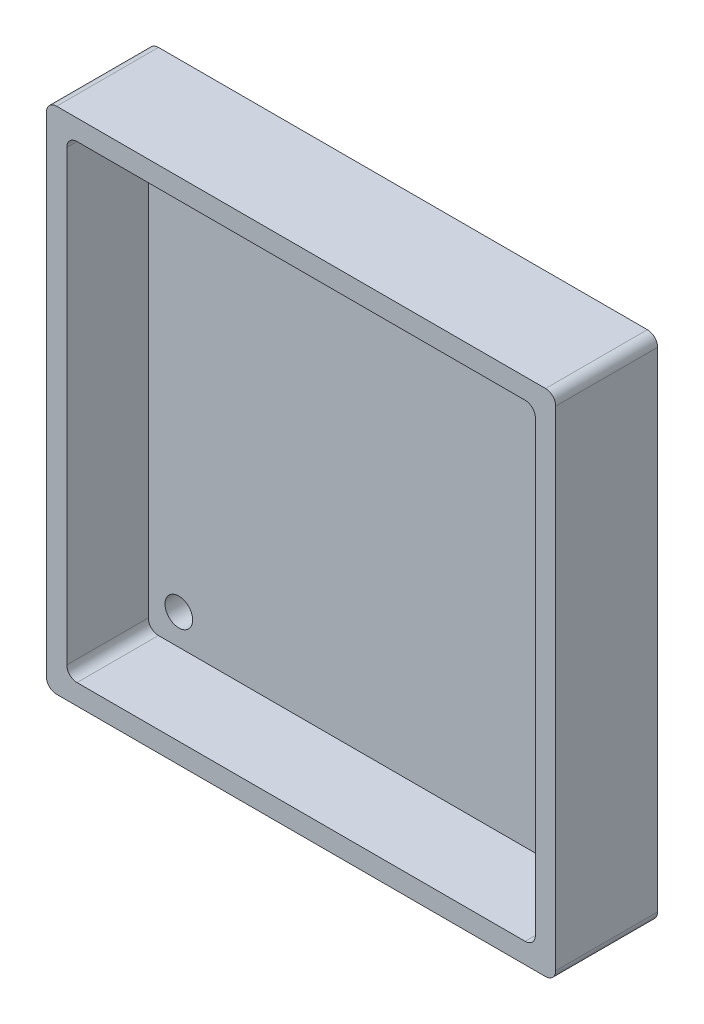
ISO-10303-21;
HEADER;
FILE_DESCRIPTION(('STEP AP214'),'2;1');
FILE_NAME('part.step','',(''),(''),'','','');
FILE_SCHEMA(('AUTOMOTIVE_DESIGN { 1 0 10303 214 1 1 1 1 }'));
ENDSEC;
DATA;
#1=APPLICATION_CONTEXT('core data for automotive mechanical design processes');
#2=APPLICATION_PROTOCOL_DEFINITION('international standard','automotive_design',2000,#1);
#3=PRODUCT_CONTEXT('',#1,'mechanical');
#4=PRODUCT('Part','Part','',(#3));
#5=PRODUCT_RELATED_PRODUCT_CATEGORY('part','',(#4));
#6=PRODUCT_DEFINITION_FORMATION('','',#4);
#7=PRODUCT_DEFINITION_CONTEXT('part definition',#1,'design');
#8=PRODUCT_DEFINITION('design','',#6,#7);
#9=PRODUCT_DEFINITION_SHAPE('','',#8);
#10=(LENGTH_UNIT() NAMED_UNIT(*) SI_UNIT(.MILLI.,.METRE.));
#11=(NAMED_UNIT(*) PLANE_ANGLE_UNIT() SI_UNIT($,.RADIAN.));
#12=(NAMED_UNIT(*) SI_UNIT($,.STERADIAN.) SOLID_ANGLE_UNIT());
#13=UNCERTAINTY_MEASURE_WITH_UNIT(LENGTH_MEASURE(1.E-05),#10,'distance_accuracy_value','');
#14=(GEOMETRIC_REPRESENTATION_CONTEXT(3) GLOBAL_UNCERTAINTY_ASSIGNED_CONTEXT((#13)) GLOBAL_UNIT_ASSIGNED_CONTEXT((#10,
#11,#12)) REPRESENTATION_CONTEXT('',''));
#15=CARTESIAN_POINT('',(0.,0.,0.));
#16=DIRECTION('',(0.,0.,1.));
#17=DIRECTION('',(1.,0.,0.));
#18=AXIS2_PLACEMENT_3D('',#15,#16,#17);
#19=CARTESIAN_POINT('',(-50.,50.,20.));
#20=DIRECTION('',(1.,0.,0.));
#21=DIRECTION('',(0.,1.,0.));
#22=AXIS2_PLACEMENT_3D('',#19,#20,#21);
#23=PLANE('',#22);
#24=DIRECTION('',(0.,-1.,0.));
#25=VECTOR('',#24,1.);
#26=CARTESIAN_POINT('',(-50.,50.,0.));
#27=LINE('',#26,#25);
#28=CARTESIAN_POINT('',(-50.,48.,0.));
#29=VERTEX_POINT('',#28);
#30=CARTESIAN_POINT('',(-50.,-48.,0.));
#31=VERTEX_POINT('',#30);
#32=EDGE_CURVE('E204',#29,#31,#27,.T.);
#33=ORIENTED_EDGE('',*,*,#32,.T.);
#34=DIRECTION('',(0.,0.,-1.));
#35=VECTOR('',#34,1.);
#36=CARTESIAN_POINT('',(-50.,-48.,20.));
#37=LINE('',#36,#35);
#38=CARTESIAN_POINT('',(-50.,-48.,20.));
#39=VERTEX_POINT('',#38);
#40=EDGE_CURVE('E264',#31,#39,#37,.F.);
#41=ORIENTED_EDGE('',*,*,#40,.T.);
#42=DIRECTION('',(0.,-1.,0.));
#43=VECTOR('',#42,1.);
#44=CARTESIAN_POINT('',(-50.,50.,20.));
#45=LINE('',#44,#43);
#46=CARTESIAN_POINT('',(-50.,48.,20.));
#47=VERTEX_POINT('',#46);
#48=EDGE_CURVE('E193',#47,#39,#45,.T.);
#49=ORIENTED_EDGE('',*,*,#48,.F.);
#50=DIRECTION('',(0.,0.,-1.));
#51=VECTOR('',#50,1.);
#52=CARTESIAN_POINT('',(-50.,48.,20.));
#53=LINE('',#52,#51);
#54=EDGE_CURVE('E261',#47,#29,#53,.T.);
#55=ORIENTED_EDGE('',*,*,#54,.T.);
#56=EDGE_LOOP('',(#33,#41,#49,#55));
#57=FACE_BOUND('',#56,.T.);
#58=ADVANCED_FACE('F37',(#57),#23,.F.);
#59=CARTESIAN_POINT('',(50.,-50.,20.));
#60=DIRECTION('',(0.,1.,0.));
#61=DIRECTION('',(-1.,0.,0.));
#62=AXIS2_PLACEMENT_3D('',#59,#60,#61);
#63=PLANE('',#62);
#64=DIRECTION('',(1.,0.,0.));
#65=VECTOR('',#64,1.);
#66=CARTESIAN_POINT('',(50.,-50.,0.));
#67=LINE('',#66,#65);
#68=CARTESIAN_POINT('',(-48.,-50.,0.));
#69=VERTEX_POINT('',#68);
#70=CARTESIAN_POINT('',(48.,-50.,0.));
#71=VERTEX_POINT('',#70);
#72=EDGE_CURVE('E207',#69,#71,#67,.T.);
#73=ORIENTED_EDGE('',*,*,#72,.T.);
#74=DIRECTION('',(0.,0.,-1.));
#75=VECTOR('',#74,1.);
#76=CARTESIAN_POINT('',(48.,-50.,20.));
#77=LINE('',#76,#75);
#78=CARTESIAN_POINT('',(48.,-50.,20.));
#79=VERTEX_POINT('',#78);
#80=EDGE_CURVE('E252',#71,#79,#77,.F.);
#81=ORIENTED_EDGE('',*,*,#80,.T.);
#82=DIRECTION('',(1.,0.,0.));
#83=VECTOR('',#82,1.);
#84=CARTESIAN_POINT('',(50.,-50.,20.));
#85=LINE('',#84,#83);
#86=CARTESIAN_POINT('',(-48.,-50.,20.));
#87=VERTEX_POINT('',#86);
#88=EDGE_CURVE('E196',#87,#79,#85,.T.);
#89=ORIENTED_EDGE('',*,*,#88,.F.);
#90=DIRECTION('',(0.,0.,-1.));
#91=VECTOR('',#90,1.);
#92=CARTESIAN_POINT('',(-48.,-50.,20.));
#93=LINE('',#92,#91);
#94=EDGE_CURVE('E249',#87,#69,#93,.T.);
#95=ORIENTED_EDGE('',*,*,#94,.T.);
#96=EDGE_LOOP('',(#73,#81,#89,#95));
#97=FACE_BOUND('',#96,.T.);
#98=ADVANCED_FACE('F347',(#97),#63,.F.);
#99=CARTESIAN_POINT('',(50.,50.,20.));
#100=DIRECTION('',(-1.,0.,0.));
#101=DIRECTION('',(0.,-1.,0.));
#102=AXIS2_PLACEMENT_3D('',#99,#100,#101);
#103=PLANE('',#102);
#104=DIRECTION('',(0.,1.,0.));
#105=VECTOR('',#104,1.);
#106=CARTESIAN_POINT('',(50.,50.,20.));
#107=LINE('',#106,#105);
#108=CARTESIAN_POINT('',(50.,-48.,20.));
#109=VERTEX_POINT('',#108);
#110=CARTESIAN_POINT('',(50.,48.,20.));
#111=VERTEX_POINT('',#110);
#112=EDGE_CURVE('E200',#109,#111,#107,.T.);
#113=ORIENTED_EDGE('',*,*,#112,.F.);
#114=DIRECTION('',(0.,0.,-1.));
#115=VECTOR('',#114,1.);
#116=CARTESIAN_POINT('',(50.,-48.,20.));
#117=LINE('',#116,#115);
#118=CARTESIAN_POINT('',(50.,-48.,0.));
#119=VERTEX_POINT('',#118);
#120=EDGE_CURVE('E238',#109,#119,#117,.T.);
#121=ORIENTED_EDGE('',*,*,#120,.T.);
#122=DIRECTION('',(0.,1.,0.));
#123=VECTOR('',#122,1.);
#124=CARTESIAN_POINT('',(50.,50.,0.));
#125=LINE('',#124,#123);
#126=CARTESIAN_POINT('',(50.,48.,0.));
#127=VERTEX_POINT('',#126);
#128=EDGE_CURVE('E210',#119,#127,#125,.T.);
#129=ORIENTED_EDGE('',*,*,#128,.T.);
#130=DIRECTION('',(0.,0.,-1.));
#131=VECTOR('',#130,1.);
#132=CARTESIAN_POINT('',(50.,48.,20.));
#133=LINE('',#132,#131);
#134=EDGE_CURVE('E236',#127,#111,#133,.F.);
#135=ORIENTED_EDGE('',*,*,#134,.T.);
#136=EDGE_LOOP('',(#113,#121,#129,#135));
#137=FACE_BOUND('',#136,.T.);
#138=ADVANCED_FACE('F353',(#137),#103,.F.);
#139=CARTESIAN_POINT('',(50.,50.,20.));
#140=DIRECTION('',(0.,-1.,0.));
#141=DIRECTION('',(1.,0.,0.));
#142=AXIS2_PLACEMENT_3D('',#139,#140,#141);
#143=PLANE('',#142);
#144=DIRECTION('',(-1.,0.,0.));
#145=VECTOR('',#144,1.);
#146=CARTESIAN_POINT('',(50.,50.,0.));
#147=LINE('',#146,#145);
#148=CARTESIAN_POINT('',(48.,50.,0.));
#149=VERTEX_POINT('',#148);
#150=CARTESIAN_POINT('',(-48.,50.,0.));
#151=VERTEX_POINT('',#150);
#152=EDGE_CURVE('E197',#149,#151,#147,.T.);
#153=ORIENTED_EDGE('',*,*,#152,.T.);
#154=DIRECTION('',(0.,0.,-1.));
#155=VECTOR('',#154,1.);
#156=CARTESIAN_POINT('',(-48.,50.,20.));
#157=LINE('',#156,#155);
#158=CARTESIAN_POINT('',(-48.,50.,20.));
#159=VERTEX_POINT('',#158);
#160=EDGE_CURVE('E54',#151,#159,#157,.F.);
#161=ORIENTED_EDGE('',*,*,#160,.T.);
#162=DIRECTION('',(-1.,0.,0.));
#163=VECTOR('',#162,1.);
#164=CARTESIAN_POINT('',(50.,50.,20.));
#165=LINE('',#164,#163);
#166=CARTESIAN_POINT('',(48.,50.,20.));
#167=VERTEX_POINT('',#166);
#168=EDGE_CURVE('E202',#167,#159,#165,.T.);
#169=ORIENTED_EDGE('',*,*,#168,.F.);
#170=DIRECTION('',(0.,0.,-1.));
#171=VECTOR('',#170,1.);
#172=CARTESIAN_POINT('',(48.,50.,20.));
#173=LINE('',#172,#171);
#174=EDGE_CURVE('E266',#167,#149,#173,.T.);
#175=ORIENTED_EDGE('',*,*,#174,.T.);
#176=EDGE_LOOP('',(#153,#161,#169,#175));
#177=FACE_BOUND('',#176,.T.);
#178=ADVANCED_FACE('F532',(#177),#143,.F.);
#179=CARTESIAN_POINT('',(0.,0.,20.));
#180=DIRECTION('',(0.,0.,-1.));
#181=DIRECTION('',(-1.,0.,0.));
#182=AXIS2_PLACEMENT_3D('',#179,#180,#181);
#183=PLANE('',#182);
#184=DIRECTION('',(1.,0.,0.));
#185=VECTOR('',#184,1.);
#186=CARTESIAN_POINT('',(46.,-46.,20.));
#187=LINE('',#186,#185);
#188=CARTESIAN_POINT('',(-44.,-46.,20.));
#189=VERTEX_POINT('',#188);
#190=CARTESIAN_POINT('',(44.,-46.,20.));
#191=VERTEX_POINT('',#190);
#192=EDGE_CURVE('E178',#189,#191,#187,.T.);
#193=ORIENTED_EDGE('',*,*,#192,.F.);
#194=CARTESIAN_POINT('',(-44.,-44.,20.));
#195=DIRECTION('',(0.,0.,-1.));
#196=DIRECTION('',(-1.,0.,0.));
#197=AXIS2_PLACEMENT_3D('',#194,#195,#196);
#198=CIRCLE('',#197,2.);
#199=CARTESIAN_POINT('',(-46.,-44.,20.));
#200=VERTEX_POINT('',#199);
#201=EDGE_CURVE('E11',#189,#200,#198,.T.);
#202=ORIENTED_EDGE('',*,*,#201,.T.);
#203=DIRECTION('',(0.,-1.,0.));
#204=VECTOR('',#203,1.);
#205=CARTESIAN_POINT('',(-46.,-46.,20.));
#206=LINE('',#205,#204);
#207=CARTESIAN_POINT('',(-46.,44.,20.));
#208=VERTEX_POINT('',#207);
#209=EDGE_CURVE('E169',#208,#200,#206,.T.);
#210=ORIENTED_EDGE('',*,*,#209,.F.);
#211=CARTESIAN_POINT('',(-44.,44.,20.));
#212=DIRECTION('',(0.,0.,-1.));
#213=DIRECTION('',(-1.,0.,0.));
#214=AXIS2_PLACEMENT_3D('',#211,#212,#213);
#215=CIRCLE('',#214,2.);
#216=CARTESIAN_POINT('',(-44.,46.,20.));
#217=VERTEX_POINT('',#216);
#218=EDGE_CURVE('E153',#208,#217,#215,.T.);
#219=ORIENTED_EDGE('',*,*,#218,.T.);
#220=DIRECTION('',(-1.,0.,0.));
#221=VECTOR('',#220,1.);
#222=CARTESIAN_POINT('',(46.,46.,20.));
#223=LINE('',#222,#221);
#224=CARTESIAN_POINT('',(44.,46.,20.));
#225=VERTEX_POINT('',#224);
#226=EDGE_CURVE('E191',#225,#217,#223,.T.);
#227=ORIENTED_EDGE('',*,*,#226,.F.);
#228=CARTESIAN_POINT('',(44.,44.,20.));
#229=DIRECTION('',(0.,0.,-1.));
#230=DIRECTION('',(-1.,0.,0.));
#231=AXIS2_PLACEMENT_3D('',#228,#229,#230);
#232=CIRCLE('',#231,2.);
#233=CARTESIAN_POINT('',(46.,44.,20.));
#234=VERTEX_POINT('',#233);
#235=EDGE_CURVE('E163',#225,#234,#232,.T.);
#236=ORIENTED_EDGE('',*,*,#235,.T.);
#237=DIRECTION('',(0.,1.,0.));
#238=VECTOR('',#237,1.);
#239=CARTESIAN_POINT('',(46.,-46.,20.));
#240=LINE('',#239,#238);
#241=CARTESIAN_POINT('',(46.,-44.,20.));
#242=VERTEX_POINT('',#241);
#243=EDGE_CURVE('E181',#242,#234,#240,.T.);
#244=ORIENTED_EDGE('',*,*,#243,.F.);
#245=CARTESIAN_POINT('',(44.,-44.,20.));
#246=DIRECTION('',(0.,0.,-1.));
#247=DIRECTION('',(-1.,0.,0.));
#248=AXIS2_PLACEMENT_3D('',#245,#246,#247);
#249=CIRCLE('',#248,2.);
#250=EDGE_CURVE('E46',#242,#191,#249,.T.);
#251=ORIENTED_EDGE('',*,*,#250,.T.);
#252=EDGE_LOOP('',(#193,#202,#210,#219,#227,#236,#244,#251));
#253=FACE_BOUND('',#252,.T.);
#254=ORIENTED_EDGE('',*,*,#88,.T.);
#255=CARTESIAN_POINT('',(48.,-48.,20.));
#256=DIRECTION('',(0.,0.,-1.));
#257=DIRECTION('',(-1.,0.,0.));
#258=AXIS2_PLACEMENT_3D('',#255,#256,#257);
#259=CIRCLE('',#258,2.);
#260=EDGE_CURVE('E259',#79,#109,#259,.F.);
#261=ORIENTED_EDGE('',*,*,#260,.T.);
#262=ORIENTED_EDGE('',*,*,#112,.T.);
#263=CARTESIAN_POINT('',(48.,48.,20.));
#264=DIRECTION('',(0.,0.,-1.));
#265=DIRECTION('',(-1.,0.,0.));
#266=AXIS2_PLACEMENT_3D('',#263,#264,#265);
#267=CIRCLE('',#266,2.);
#268=EDGE_CURVE('E61',#111,#167,#267,.F.);
#269=ORIENTED_EDGE('',*,*,#268,.T.);
#270=ORIENTED_EDGE('',*,*,#168,.T.);
#271=CARTESIAN_POINT('',(-48.,48.,20.));
#272=DIRECTION('',(0.,0.,-1.));
#273=DIRECTION('',(-1.,0.,0.));
#274=AXIS2_PLACEMENT_3D('',#271,#272,#273);
#275=CIRCLE('',#274,2.);
#276=EDGE_CURVE('E255',#159,#47,#275,.F.);
#277=ORIENTED_EDGE('',*,*,#276,.T.);
#278=ORIENTED_EDGE('',*,*,#48,.T.);
#279=CARTESIAN_POINT('',(-48.,-48.,20.));
#280=DIRECTION('',(0.,0.,-1.));
#281=DIRECTION('',(-1.,0.,0.));
#282=AXIS2_PLACEMENT_3D('',#279,#280,#281);
#283=CIRCLE('',#282,2.);
#284=EDGE_CURVE('E257',#39,#87,#283,.F.);
#285=ORIENTED_EDGE('',*,*,#284,.T.);
#286=EDGE_LOOP('',(#254,#261,#262,#269,#270,#277,#278,#285));
#287=FACE_BOUND('',#286,.T.);
#288=ADVANCED_FACE('F177',(#253,#287),#183,.F.);
#289=CARTESIAN_POINT('',(0.,0.,0.));
#290=DIRECTION('',(0.,0.,-1.));
#291=DIRECTION('',(-1.,0.,0.));
#292=AXIS2_PLACEMENT_3D('',#289,#290,#291);
#293=PLANE('',#292);
#294=CARTESIAN_POINT('',(-39.9999999999977,-40.,0.));
#295=DIRECTION('',(0.,0.,1.));
#296=DIRECTION('',(1.,0.,0.));
#297=AXIS2_PLACEMENT_3D('',#294,#295,#296);
#298=CIRCLE('',#297,2.71396680124798);
#299=CARTESIAN_POINT('',(-37.2860331987498,-40.,0.));
#300=VERTEX_POINT('',#299);
#301=EDGE_CURVE('E295',#300,#300,#298,.T.);
#302=ORIENTED_EDGE('',*,*,#301,.T.);
#303=EDGE_LOOP('',(#302));
#304=FACE_BOUND('',#303,.T.);
#305=CARTESIAN_POINT('',(40.0000000000023,-39.9999999999978,0.));
#306=DIRECTION('',(0.,0.,1.));
#307=DIRECTION('',(1.,0.,0.));
#308=AXIS2_PLACEMENT_3D('',#305,#306,#307);
#309=CIRCLE('',#308,2.71396680124995);
#310=CARTESIAN_POINT('',(42.7139668012522,-39.9999999999978,0.));
#311=VERTEX_POINT('',#310);
#312=EDGE_CURVE('E292',#311,#311,#309,.T.);
#313=ORIENTED_EDGE('',*,*,#312,.T.);
#314=EDGE_LOOP('',(#313));
#315=FACE_BOUND('',#314,.T.);
#316=CARTESIAN_POINT('',(40.,40.0000000000023,0.));
#317=DIRECTION('',(0.,0.,1.));
#318=DIRECTION('',(1.,0.,0.));
#319=AXIS2_PLACEMENT_3D('',#316,#317,#318);
#320=CIRCLE('',#319,2.71396680124912);
#321=CARTESIAN_POINT('',(42.7139668012491,40.0000000000023,0.));
#322=VERTEX_POINT('',#321);
#323=EDGE_CURVE('E294',#322,#322,#320,.T.);
#324=ORIENTED_EDGE('',*,*,#323,.T.);
#325=EDGE_LOOP('',(#324));
#326=FACE_BOUND('',#325,.T.);
#327=CARTESIAN_POINT('',(-40.,40.,0.));
#328=DIRECTION('',(0.,0.,1.));
#329=DIRECTION('',(1.,0.,0.));
#330=AXIS2_PLACEMENT_3D('',#327,#328,#329);
#331=CIRCLE('',#330,2.71396680124678);
#332=CARTESIAN_POINT('',(-37.2860331987532,40.,0.));
#333=VERTEX_POINT('',#332);
#334=EDGE_CURVE('E276',#333,#333,#331,.T.);
#335=ORIENTED_EDGE('',*,*,#334,.T.);
#336=EDGE_LOOP('',(#335));
#337=FACE_BOUND('',#336,.T.);
#338=ORIENTED_EDGE('',*,*,#128,.F.);
#339=CARTESIAN_POINT('',(48.,-48.,0.));
#340=DIRECTION('',(0.,0.,-1.));
#341=DIRECTION('',(-1.,0.,0.));
#342=AXIS2_PLACEMENT_3D('',#339,#340,#341);
#343=CIRCLE('',#342,2.);
#344=EDGE_CURVE('E247',#119,#71,#343,.T.);
#345=ORIENTED_EDGE('',*,*,#344,.T.);
#346=ORIENTED_EDGE('',*,*,#72,.F.);
#347=CARTESIAN_POINT('',(-48.,-48.,0.));
#348=DIRECTION('',(0.,0.,-1.));
#349=DIRECTION('',(-1.,0.,0.));
#350=AXIS2_PLACEMENT_3D('',#347,#348,#349);
#351=CIRCLE('',#350,2.);
#352=EDGE_CURVE('E245',#69,#31,#351,.T.);
#353=ORIENTED_EDGE('',*,*,#352,.T.);
#354=ORIENTED_EDGE('',*,*,#32,.F.);
#355=CARTESIAN_POINT('',(-48.,48.,0.));
#356=DIRECTION('',(0.,0.,-1.));
#357=DIRECTION('',(-1.,0.,0.));
#358=AXIS2_PLACEMENT_3D('',#355,#356,#357);
#359=CIRCLE('',#358,2.);
#360=EDGE_CURVE('E243',#29,#151,#359,.T.);
#361=ORIENTED_EDGE('',*,*,#360,.T.);
#362=ORIENTED_EDGE('',*,*,#152,.F.);
#363=CARTESIAN_POINT('',(48.,48.,0.));
#364=DIRECTION('',(0.,0.,-1.));
#365=DIRECTION('',(-1.,0.,0.));
#366=AXIS2_PLACEMENT_3D('',#363,#364,#365);
#367=CIRCLE('',#366,2.);
#368=EDGE_CURVE('E241',#149,#127,#367,.T.);
#369=ORIENTED_EDGE('',*,*,#368,.T.);
#370=EDGE_LOOP('',(#338,#345,#346,#353,#354,#361,#362,#369));
#371=FACE_BOUND('',#370,.T.);
#372=ADVANCED_FACE('F420',(#304,#315,#326,#337,#371),#293,.T.);
#373=CARTESIAN_POINT('',(-46.,-46.,4.));
#374=DIRECTION('',(-1.,0.,0.));
#375=DIRECTION('',(0.,0.,1.));
#376=AXIS2_PLACEMENT_3D('',#373,#374,#375);
#377=PLANE('',#376);
#378=DIRECTION('',(0.,-1.,0.));
#379=VECTOR('',#378,1.);
#380=CARTESIAN_POINT('',(-46.,-46.,4.));
#381=LINE('',#380,#379);
#382=CARTESIAN_POINT('',(-46.,44.,4.));
#383=VERTEX_POINT('',#382);
#384=CARTESIAN_POINT('',(-46.,-44.,4.));
#385=VERTEX_POINT('',#384);
#386=EDGE_CURVE('E172',#383,#385,#381,.T.);
#387=ORIENTED_EDGE('',*,*,#386,.F.);
#388=DIRECTION('',(0.,0.,1.));
#389=VECTOR('',#388,1.);
#390=CARTESIAN_POINT('',(-46.,44.,20.));
#391=LINE('',#390,#389);
#392=EDGE_CURVE('E157',#383,#208,#391,.T.);
#393=ORIENTED_EDGE('',*,*,#392,.T.);
#394=ORIENTED_EDGE('',*,*,#209,.T.);
#395=DIRECTION('',(0.,0.,1.));
#396=VECTOR('',#395,1.);
#397=CARTESIAN_POINT('',(-46.,-44.,4.));
#398=LINE('',#397,#396);
#399=EDGE_CURVE('E174',#200,#385,#398,.F.);
#400=ORIENTED_EDGE('',*,*,#399,.T.);
#401=EDGE_LOOP('',(#387,#393,#394,#400));
#402=FACE_BOUND('',#401,.T.);
#403=ADVANCED_FACE('F168',(#402),#377,.F.);
#404=CARTESIAN_POINT('',(46.,46.,4.));
#405=DIRECTION('',(0.,1.,0.));
#406=DIRECTION('',(-1.,0.,0.));
#407=AXIS2_PLACEMENT_3D('',#404,#405,#406);
#408=PLANE('',#407);
#409=ORIENTED_EDGE('',*,*,#226,.T.);
#410=DIRECTION('',(0.,0.,1.));
#411=VECTOR('',#410,1.);
#412=CARTESIAN_POINT('',(-44.,46.,4.));
#413=LINE('',#412,#411);
#414=CARTESIAN_POINT('',(-44.,46.,4.));
#415=VERTEX_POINT('',#414);
#416=EDGE_CURVE('E158',#217,#415,#413,.F.);
#417=ORIENTED_EDGE('',*,*,#416,.T.);
#418=DIRECTION('',(-1.,0.,0.));
#419=VECTOR('',#418,1.);
#420=CARTESIAN_POINT('',(46.,46.,4.));
#421=LINE('',#420,#419);
#422=CARTESIAN_POINT('',(44.,46.,4.));
#423=VERTEX_POINT('',#422);
#424=EDGE_CURVE('E186',#423,#415,#421,.T.);
#425=ORIENTED_EDGE('',*,*,#424,.F.);
#426=DIRECTION('',(0.,0.,1.));
#427=VECTOR('',#426,1.);
#428=CARTESIAN_POINT('',(44.,46.,20.));
#429=LINE('',#428,#427);
#430=EDGE_CURVE('E173',#423,#225,#429,.T.);
#431=ORIENTED_EDGE('',*,*,#430,.T.);
#432=EDGE_LOOP('',(#409,#417,#425,#431));
#433=FACE_BOUND('',#432,.T.);
#434=ADVANCED_FACE('F316',(#433),#408,.F.);
#435=CARTESIAN_POINT('',(46.,-46.,4.));
#436=DIRECTION('',(1.,0.,0.));
#437=DIRECTION('',(0.,0.,-1.));
#438=AXIS2_PLACEMENT_3D('',#435,#436,#437);
#439=PLANE('',#438);
#440=ORIENTED_EDGE('',*,*,#243,.T.);
#441=DIRECTION('',(0.,0.,1.));
#442=VECTOR('',#441,1.);
#443=CARTESIAN_POINT('',(46.,44.,4.));
#444=LINE('',#443,#442);
#445=CARTESIAN_POINT('',(46.,44.,4.));
#446=VERTEX_POINT('',#445);
#447=EDGE_CURVE('E229',#234,#446,#444,.F.);
#448=ORIENTED_EDGE('',*,*,#447,.T.);
#449=DIRECTION('',(0.,1.,0.));
#450=VECTOR('',#449,1.);
#451=CARTESIAN_POINT('',(46.,-46.,4.));
#452=LINE('',#451,#450);
#453=CARTESIAN_POINT('',(46.,-44.,4.));
#454=VERTEX_POINT('',#453);
#455=EDGE_CURVE('E307',#454,#446,#452,.T.);
#456=ORIENTED_EDGE('',*,*,#455,.F.);
#457=DIRECTION('',(0.,0.,1.));
#458=VECTOR('',#457,1.);
#459=CARTESIAN_POINT('',(46.,-44.,20.));
#460=LINE('',#459,#458);
#461=EDGE_CURVE('E226',#454,#242,#460,.T.);
#462=ORIENTED_EDGE('',*,*,#461,.T.);
#463=EDGE_LOOP('',(#440,#448,#456,#462));
#464=FACE_BOUND('',#463,.T.);
#465=ADVANCED_FACE('F322',(#464),#439,.F.);
#466=CARTESIAN_POINT('',(46.,-46.,4.));
#467=DIRECTION('',(0.,-1.,0.));
#468=DIRECTION('',(1.,0.,0.));
#469=AXIS2_PLACEMENT_3D('',#466,#467,#468);
#470=PLANE('',#469);
#471=ORIENTED_EDGE('',*,*,#192,.T.);
#472=DIRECTION('',(0.,0.,1.));
#473=VECTOR('',#472,1.);
#474=CARTESIAN_POINT('',(44.,-46.,4.));
#475=LINE('',#474,#473);
#476=CARTESIAN_POINT('',(44.,-46.,4.));
#477=VERTEX_POINT('',#476);
#478=EDGE_CURVE('E234',#191,#477,#475,.F.);
#479=ORIENTED_EDGE('',*,*,#478,.T.);
#480=DIRECTION('',(1.,0.,0.));
#481=VECTOR('',#480,1.);
#482=CARTESIAN_POINT('',(46.,-46.,4.));
#483=LINE('',#482,#481);
#484=CARTESIAN_POINT('',(-44.,-46.,4.));
#485=VERTEX_POINT('',#484);
#486=EDGE_CURVE('E305',#485,#477,#483,.T.);
#487=ORIENTED_EDGE('',*,*,#486,.F.);
#488=DIRECTION('',(0.,0.,1.));
#489=VECTOR('',#488,1.);
#490=CARTESIAN_POINT('',(-44.,-46.,20.));
#491=LINE('',#490,#489);
#492=EDGE_CURVE('E231',#485,#189,#491,.T.);
#493=ORIENTED_EDGE('',*,*,#492,.T.);
#494=EDGE_LOOP('',(#471,#479,#487,#493));
#495=FACE_BOUND('',#494,.T.);
#496=ADVANCED_FACE('F329',(#495),#470,.F.);
#497=CARTESIAN_POINT('',(0.,0.,4.));
#498=DIRECTION('',(0.,0.,1.));
#499=DIRECTION('',(1.,0.,0.));
#500=AXIS2_PLACEMENT_3D('',#497,#498,#499);
#501=PLANE('',#500);
#502=CARTESIAN_POINT('',(-39.9999999999977,-40.,4.));
#503=DIRECTION('',(0.,0.,1.));
#504=DIRECTION('',(1.,0.,0.));
#505=AXIS2_PLACEMENT_3D('',#502,#503,#504);
#506=CIRCLE('',#505,2.71396680124798);
#507=CARTESIAN_POINT('',(-37.2860331987498,-40.,4.));
#508=VERTEX_POINT('',#507);
#509=EDGE_CURVE('E41',#508,#508,#506,.F.);
#510=ORIENTED_EDGE('',*,*,#509,.T.);
#511=EDGE_LOOP('',(#510));
#512=FACE_BOUND('',#511,.T.);
#513=CARTESIAN_POINT('',(40.0000000000023,-39.9999999999978,4.));
#514=DIRECTION('',(0.,0.,1.));
#515=DIRECTION('',(1.,0.,0.));
#516=AXIS2_PLACEMENT_3D('',#513,#514,#515);
#517=CIRCLE('',#516,2.71396680124995);
#518=CARTESIAN_POINT('',(42.7139668012522,-39.9999999999978,4.));
#519=VERTEX_POINT('',#518);
#520=EDGE_CURVE('E184',#519,#519,#517,.F.);
#521=ORIENTED_EDGE('',*,*,#520,.T.);
#522=EDGE_LOOP('',(#521));
#523=FACE_BOUND('',#522,.T.);
#524=CARTESIAN_POINT('',(40.,40.0000000000023,4.));
#525=DIRECTION('',(0.,0.,1.));
#526=DIRECTION('',(1.,0.,0.));
#527=AXIS2_PLACEMENT_3D('',#524,#525,#526);
#528=CIRCLE('',#527,2.71396680124912);
#529=CARTESIAN_POINT('',(42.7139668012491,40.0000000000023,4.));
#530=VERTEX_POINT('',#529);
#531=EDGE_CURVE('E275',#530,#530,#528,.F.);
#532=ORIENTED_EDGE('',*,*,#531,.T.);
#533=EDGE_LOOP('',(#532));
#534=FACE_BOUND('',#533,.T.);
#535=CARTESIAN_POINT('',(-40.,40.,4.));
#536=DIRECTION('',(0.,0.,1.));
#537=DIRECTION('',(1.,0.,0.));
#538=AXIS2_PLACEMENT_3D('',#535,#536,#537);
#539=CIRCLE('',#538,2.71396680124678);
#540=CARTESIAN_POINT('',(-37.2860331987532,40.,4.));
#541=VERTEX_POINT('',#540);
#542=EDGE_CURVE('E272',#541,#541,#539,.F.);
#543=ORIENTED_EDGE('',*,*,#542,.T.);
#544=EDGE_LOOP('',(#543));
#545=FACE_BOUND('',#544,.T.);
#546=ORIENTED_EDGE('',*,*,#424,.T.);
#547=CARTESIAN_POINT('',(-44.,44.,4.));
#548=DIRECTION('',(0.,0.,1.));
#549=DIRECTION('',(1.,0.,0.));
#550=AXIS2_PLACEMENT_3D('',#547,#548,#549);
#551=CIRCLE('',#550,2.);
#552=EDGE_CURVE('E224',#415,#383,#551,.T.);
#553=ORIENTED_EDGE('',*,*,#552,.T.);
#554=ORIENTED_EDGE('',*,*,#386,.T.);
#555=CARTESIAN_POINT('',(-44.,-44.,4.));
#556=DIRECTION('',(0.,0.,1.));
#557=DIRECTION('',(1.,0.,0.));
#558=AXIS2_PLACEMENT_3D('',#555,#556,#557);
#559=CIRCLE('',#558,2.);
#560=EDGE_CURVE('E218',#385,#485,#559,.T.);
#561=ORIENTED_EDGE('',*,*,#560,.T.);
#562=ORIENTED_EDGE('',*,*,#486,.T.);
#563=CARTESIAN_POINT('',(44.,-44.,4.));
#564=DIRECTION('',(0.,0.,1.));
#565=DIRECTION('',(1.,0.,0.));
#566=AXIS2_PLACEMENT_3D('',#563,#564,#565);
#567=CIRCLE('',#566,2.);
#568=EDGE_CURVE('E220',#477,#454,#567,.T.);
#569=ORIENTED_EDGE('',*,*,#568,.T.);
#570=ORIENTED_EDGE('',*,*,#455,.T.);
#571=CARTESIAN_POINT('',(44.,44.,4.));
#572=DIRECTION('',(0.,0.,1.));
#573=DIRECTION('',(1.,0.,0.));
#574=AXIS2_PLACEMENT_3D('',#571,#572,#573);
#575=CIRCLE('',#574,2.);
#576=EDGE_CURVE('E222',#446,#423,#575,.T.);
#577=ORIENTED_EDGE('',*,*,#576,.T.);
#578=EDGE_LOOP('',(#546,#553,#554,#561,#562,#569,#570,#577));
#579=FACE_BOUND('',#578,.T.);
#580=ADVANCED_FACE('F281',(#512,#523,#534,#545,#579),#501,.T.);
#581=CARTESIAN_POINT('',(-44.,44.,4.));
#582=DIRECTION('',(0.,0.,-1.));
#583=DIRECTION('',(-1.,0.,0.));
#584=AXIS2_PLACEMENT_3D('',#581,#582,#583);
#585=CYLINDRICAL_SURFACE('',#584,2.);
#586=ORIENTED_EDGE('',*,*,#552,.F.);
#587=ORIENTED_EDGE('',*,*,#416,.F.);
#588=ORIENTED_EDGE('',*,*,#218,.F.);
#589=ORIENTED_EDGE('',*,*,#392,.F.);
#590=EDGE_LOOP('',(#586,#587,#588,#589));
#591=FACE_BOUND('',#590,.T.);
#592=ADVANCED_FACE('F156',(#591),#585,.F.);
#593=CARTESIAN_POINT('',(44.,44.,4.));
#594=DIRECTION('',(0.,0.,-1.));
#595=DIRECTION('',(-1.,0.,0.));
#596=AXIS2_PLACEMENT_3D('',#593,#594,#595);
#597=CYLINDRICAL_SURFACE('',#596,2.);
#598=ORIENTED_EDGE('',*,*,#576,.F.);
#599=ORIENTED_EDGE('',*,*,#447,.F.);
#600=ORIENTED_EDGE('',*,*,#235,.F.);
#601=ORIENTED_EDGE('',*,*,#430,.F.);
#602=EDGE_LOOP('',(#598,#599,#600,#601));
#603=FACE_BOUND('',#602,.T.);
#604=ADVANCED_FACE('F318',(#603),#597,.F.);
#605=CARTESIAN_POINT('',(44.,-44.,4.));
#606=DIRECTION('',(0.,0.,-1.));
#607=DIRECTION('',(-1.,0.,0.));
#608=AXIS2_PLACEMENT_3D('',#605,#606,#607);
#609=CYLINDRICAL_SURFACE('',#608,2.);
#610=ORIENTED_EDGE('',*,*,#568,.F.);
#611=ORIENTED_EDGE('',*,*,#478,.F.);
#612=ORIENTED_EDGE('',*,*,#250,.F.);
#613=ORIENTED_EDGE('',*,*,#461,.F.);
#614=EDGE_LOOP('',(#610,#611,#612,#613));
#615=FACE_BOUND('',#614,.T.);
#616=ADVANCED_FACE('F326',(#615),#609,.F.);
#617=CARTESIAN_POINT('',(-44.,-44.,4.));
#618=DIRECTION('',(0.,0.,-1.));
#619=DIRECTION('',(-1.,0.,0.));
#620=AXIS2_PLACEMENT_3D('',#617,#618,#619);
#621=CYLINDRICAL_SURFACE('',#620,2.);
#622=ORIENTED_EDGE('',*,*,#560,.F.);
#623=ORIENTED_EDGE('',*,*,#399,.F.);
#624=ORIENTED_EDGE('',*,*,#201,.F.);
#625=ORIENTED_EDGE('',*,*,#492,.F.);
#626=EDGE_LOOP('',(#622,#623,#624,#625));
#627=FACE_BOUND('',#626,.T.);
#628=ADVANCED_FACE('F334',(#627),#621,.F.);
#629=CARTESIAN_POINT('',(48.,-48.,20.));
#630=DIRECTION('',(0.,0.,-1.));
#631=DIRECTION('',(-1.,0.,0.));
#632=AXIS2_PLACEMENT_3D('',#629,#630,#631);
#633=CYLINDRICAL_SURFACE('',#632,2.);
#634=ORIENTED_EDGE('',*,*,#260,.F.);
#635=ORIENTED_EDGE('',*,*,#80,.F.);
#636=ORIENTED_EDGE('',*,*,#344,.F.);
#637=ORIENTED_EDGE('',*,*,#120,.F.);
#638=EDGE_LOOP('',(#634,#635,#636,#637));
#639=FACE_BOUND('',#638,.T.);
#640=ADVANCED_FACE('F336',(#639),#633,.T.);
#641=CARTESIAN_POINT('',(-48.,-48.,20.));
#642=DIRECTION('',(0.,0.,-1.));
#643=DIRECTION('',(-1.,0.,0.));
#644=AXIS2_PLACEMENT_3D('',#641,#642,#643);
#645=CYLINDRICAL_SURFACE('',#644,2.);
#646=ORIENTED_EDGE('',*,*,#284,.F.);
#647=ORIENTED_EDGE('',*,*,#40,.F.);
#648=ORIENTED_EDGE('',*,*,#352,.F.);
#649=ORIENTED_EDGE('',*,*,#94,.F.);
#650=EDGE_LOOP('',(#646,#647,#648,#649));
#651=FACE_BOUND('',#650,.T.);
#652=ADVANCED_FACE('F342',(#651),#645,.T.);
#653=CARTESIAN_POINT('',(-48.,48.,20.));
#654=DIRECTION('',(0.,0.,-1.));
#655=DIRECTION('',(-1.,0.,0.));
#656=AXIS2_PLACEMENT_3D('',#653,#654,#655);
#657=CYLINDRICAL_SURFACE('',#656,2.);
#658=ORIENTED_EDGE('',*,*,#276,.F.);
#659=ORIENTED_EDGE('',*,*,#160,.F.);
#660=ORIENTED_EDGE('',*,*,#360,.F.);
#661=ORIENTED_EDGE('',*,*,#54,.F.);
#662=EDGE_LOOP('',(#658,#659,#660,#661));
#663=FACE_BOUND('',#662,.T.);
#664=ADVANCED_FACE('F392',(#663),#657,.T.);
#665=CARTESIAN_POINT('',(48.,48.,20.));
#666=DIRECTION('',(0.,0.,-1.));
#667=DIRECTION('',(-1.,0.,0.));
#668=AXIS2_PLACEMENT_3D('',#665,#666,#667);
#669=CYLINDRICAL_SURFACE('',#668,2.);
#670=ORIENTED_EDGE('',*,*,#268,.F.);
#671=ORIENTED_EDGE('',*,*,#134,.F.);
#672=ORIENTED_EDGE('',*,*,#368,.F.);
#673=ORIENTED_EDGE('',*,*,#174,.F.);
#674=EDGE_LOOP('',(#670,#671,#672,#673));
#675=FACE_BOUND('',#674,.T.);
#676=ADVANCED_FACE('F39',(#675),#669,.T.);
#677=CARTESIAN_POINT('',(-40.,40.,16.));
#678=DIRECTION('',(0.,0.,-1.));
#679=DIRECTION('',(-1.,0.,0.));
#680=AXIS2_PLACEMENT_3D('',#677,#678,#679);
#681=CYLINDRICAL_SURFACE('',#680,2.71396680124678);
#682=ORIENTED_EDGE('',*,*,#542,.F.);
#683=EDGE_LOOP('',(#682));
#684=FACE_BOUND('',#683,.T.);
#685=ORIENTED_EDGE('',*,*,#334,.F.);
#686=EDGE_LOOP('',(#685));
#687=FACE_BOUND('',#686,.T.);
#688=ADVANCED_FACE('F412',(#684,#687),#681,.F.);
#689=CARTESIAN_POINT('',(40.,40.0000000000023,16.));
#690=DIRECTION('',(0.,0.,-1.));
#691=DIRECTION('',(-1.,0.,0.));
#692=AXIS2_PLACEMENT_3D('',#689,#690,#691);
#693=CYLINDRICAL_SURFACE('',#692,2.71396680124912);
#694=ORIENTED_EDGE('',*,*,#531,.F.);
#695=EDGE_LOOP('',(#694));
#696=FACE_BOUND('',#695,.T.);
#697=ORIENTED_EDGE('',*,*,#323,.F.);
#698=EDGE_LOOP('',(#697));
#699=FACE_BOUND('',#698,.T.);
#700=ADVANCED_FACE('F288',(#696,#699),#693,.F.);
#701=CARTESIAN_POINT('',(40.0000000000023,-39.9999999999978,16.));
#702=DIRECTION('',(0.,0.,-1.));
#703=DIRECTION('',(-1.,0.,0.));
#704=AXIS2_PLACEMENT_3D('',#701,#702,#703);
#705=CYLINDRICAL_SURFACE('',#704,2.71396680124995);
#706=ORIENTED_EDGE('',*,*,#520,.F.);
#707=EDGE_LOOP('',(#706));
#708=FACE_BOUND('',#707,.T.);
#709=ORIENTED_EDGE('',*,*,#312,.F.);
#710=EDGE_LOOP('',(#709));
#711=FACE_BOUND('',#710,.T.);
#712=ADVANCED_FACE('F284',(#708,#711),#705,.F.);
#713=CARTESIAN_POINT('',(-39.9999999999977,-40.,16.));
#714=DIRECTION('',(0.,0.,-1.));
#715=DIRECTION('',(-1.,0.,0.));
#716=AXIS2_PLACEMENT_3D('',#713,#714,#715);
#717=CYLINDRICAL_SURFACE('',#716,2.71396680124798);
#718=ORIENTED_EDGE('',*,*,#509,.F.);
#719=EDGE_LOOP('',(#718));
#720=FACE_BOUND('',#719,.T.);
#721=ORIENTED_EDGE('',*,*,#301,.F.);
#722=EDGE_LOOP('',(#721));
#723=FACE_BOUND('',#722,.T.);
#724=ADVANCED_FACE('F287',(#720,#723),#717,.F.);
#725=CLOSED_SHELL('',(#58,#98,#138,#178,#288,#372,#403,#434,#465,#496,#580,#592,#604,#616,#628,
#640,#652,#664,#676,#688,#700,#712,#724));
#726=MANIFOLD_SOLID_BREP('B2',#725);
#727=ADVANCED_BREP_SHAPE_REPRESENTATION('',(#18,#726),#14);
#728=SHAPE_DEFINITION_REPRESENTATION(#9,#727);
ENDSEC;
END-ISO-10303-21;
